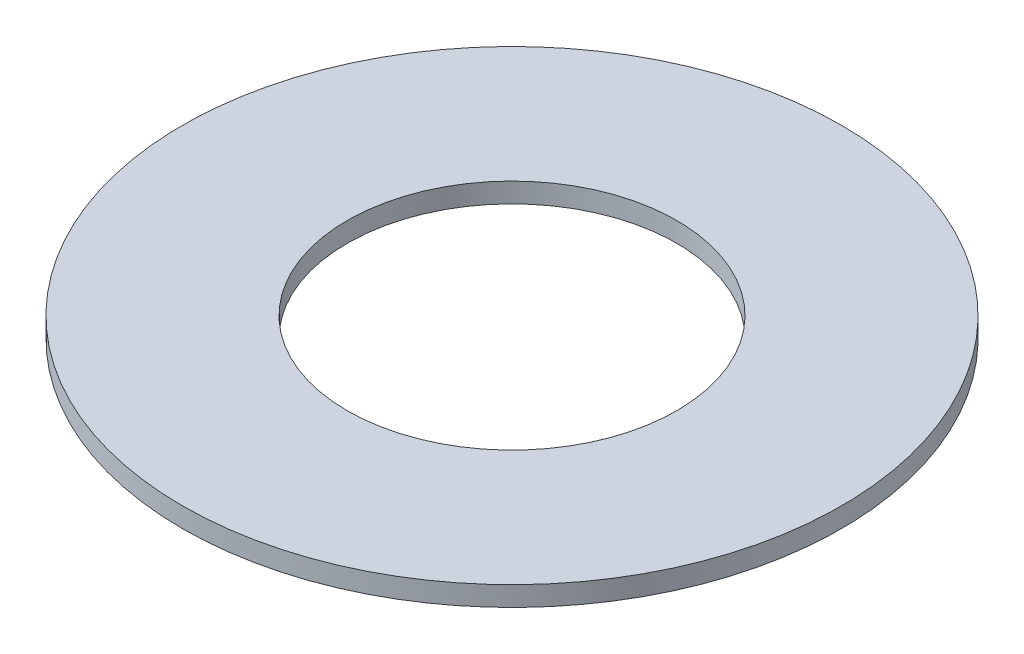
ISO-10303-21;
HEADER;
FILE_DESCRIPTION(('STEP AP214'),'2;1');
FILE_NAME('part.step','',(''),(''),'','','');
FILE_SCHEMA(('AUTOMOTIVE_DESIGN { 1 0 10303 214 1 1 1 1 }'));
ENDSEC;
DATA;
#1=APPLICATION_CONTEXT('core data for automotive mechanical design processes');
#2=APPLICATION_PROTOCOL_DEFINITION('international standard','automotive_design',2000,#1);
#3=PRODUCT_CONTEXT('',#1,'mechanical');
#4=PRODUCT('Part','Part','',(#3));
#5=PRODUCT_RELATED_PRODUCT_CATEGORY('part','',(#4));
#6=PRODUCT_DEFINITION_FORMATION('','',#4);
#7=PRODUCT_DEFINITION_CONTEXT('part definition',#1,'design');
#8=PRODUCT_DEFINITION('design','',#6,#7);
#9=PRODUCT_DEFINITION_SHAPE('','',#8);
#10=(LENGTH_UNIT() NAMED_UNIT(*) SI_UNIT(.MILLI.,.METRE.));
#11=(NAMED_UNIT(*) PLANE_ANGLE_UNIT() SI_UNIT($,.RADIAN.));
#12=(NAMED_UNIT(*) SI_UNIT($,.STERADIAN.) SOLID_ANGLE_UNIT());
#13=UNCERTAINTY_MEASURE_WITH_UNIT(LENGTH_MEASURE(1.E-05),#10,'distance_accuracy_value','');
#14=(GEOMETRIC_REPRESENTATION_CONTEXT(3) GLOBAL_UNCERTAINTY_ASSIGNED_CONTEXT((#13)) GLOBAL_UNIT_ASSIGNED_CONTEXT((#10,
#11,#12)) REPRESENTATION_CONTEXT('',''));
#15=CARTESIAN_POINT('',(0.,0.,0.));
#16=DIRECTION('',(0.,0.,1.));
#17=DIRECTION('',(1.,0.,0.));
#18=AXIS2_PLACEMENT_3D('',#15,#16,#17);
#19=CARTESIAN_POINT('',(0.,14.2862136821391,0.));
#20=DIRECTION('',(0.,1.,0.));
#21=DIRECTION('',(0.,0.,1.));
#22=AXIS2_PLACEMENT_3D('',#19,#20,#21);
#23=CYLINDRICAL_SURFACE('',#22,3.175);
#24=CARTESIAN_POINT('',(0.,-0.190500000000001,0.));
#25=DIRECTION('',(0.,1.,0.));
#26=DIRECTION('',(0.,0.,1.));
#27=AXIS2_PLACEMENT_3D('',#24,#25,#26);
#28=CIRCLE('',#27,3.175);
#29=CARTESIAN_POINT('',(0.,-0.190500000000001,3.175));
#30=VERTEX_POINT('',#29);
#31=EDGE_CURVE('E10',#30,#30,#28,.T.);
#32=ORIENTED_EDGE('',*,*,#31,.F.);
#33=EDGE_LOOP('',(#32));
#34=FACE_BOUND('',#33,.T.);
#35=CARTESIAN_POINT('',(0.,0.190499999999998,0.));
#36=DIRECTION('',(0.,1.,0.));
#37=DIRECTION('',(0.,0.,1.));
#38=AXIS2_PLACEMENT_3D('',#35,#36,#37);
#39=CIRCLE('',#38,3.175);
#40=CARTESIAN_POINT('',(0.,0.190499999999998,3.175));
#41=VERTEX_POINT('',#40);
#42=EDGE_CURVE('E55',#41,#41,#39,.T.);
#43=ORIENTED_EDGE('',*,*,#42,.T.);
#44=EDGE_LOOP('',(#43));
#45=FACE_BOUND('',#44,.T.);
#46=ADVANCED_FACE('F32',(#34,#45),#23,.F.);
#47=CARTESIAN_POINT('',(0.,-0.190500000000001,-3.175));
#48=DIRECTION('',(0.,1.,0.));
#49=DIRECTION('',(0.,0.,1.));
#50=AXIS2_PLACEMENT_3D('',#47,#48,#49);
#51=PLANE('',#50);
#52=CARTESIAN_POINT('',(0.,-0.190500000000001,0.));
#53=DIRECTION('',(0.,1.,0.));
#54=DIRECTION('',(0.,0.,1.));
#55=AXIS2_PLACEMENT_3D('',#52,#53,#54);
#56=CIRCLE('',#55,6.35);
#57=CARTESIAN_POINT('',(0.,-0.190500000000001,6.35));
#58=VERTEX_POINT('',#57);
#59=EDGE_CURVE('E39',#58,#58,#56,.T.);
#60=ORIENTED_EDGE('',*,*,#59,.F.);
#61=EDGE_LOOP('',(#60));
#62=FACE_BOUND('',#61,.T.);
#63=ORIENTED_EDGE('',*,*,#31,.T.);
#64=EDGE_LOOP('',(#63));
#65=FACE_BOUND('',#64,.T.);
#66=ADVANCED_FACE('F72',(#62,#65),#51,.F.);
#67=CARTESIAN_POINT('',(0.,14.2862136821391,0.));
#68=DIRECTION('',(0.,1.,0.));
#69=DIRECTION('',(0.,0.,1.));
#70=AXIS2_PLACEMENT_3D('',#67,#68,#69);
#71=CYLINDRICAL_SURFACE('',#70,6.35);
#72=CARTESIAN_POINT('',(0.,0.1905,0.));
#73=DIRECTION('',(0.,1.,0.));
#74=DIRECTION('',(0.,0.,1.));
#75=AXIS2_PLACEMENT_3D('',#72,#73,#74);
#76=CIRCLE('',#75,6.35);
#77=CARTESIAN_POINT('',(0.,0.1905,6.35));
#78=VERTEX_POINT('',#77);
#79=EDGE_CURVE('E47',#78,#78,#76,.T.);
#80=ORIENTED_EDGE('',*,*,#79,.F.);
#81=EDGE_LOOP('',(#80));
#82=FACE_BOUND('',#81,.T.);
#83=ORIENTED_EDGE('',*,*,#59,.T.);
#84=EDGE_LOOP('',(#83));
#85=FACE_BOUND('',#84,.T.);
#86=ADVANCED_FACE('F67',(#82,#85),#71,.T.);
#87=CARTESIAN_POINT('',(0.,0.190499999999999,-3.175));
#88=DIRECTION('',(0.,-1.,0.));
#89=DIRECTION('',(0.,0.,-1.));
#90=AXIS2_PLACEMENT_3D('',#87,#88,#89);
#91=PLANE('',#90);
#92=ORIENTED_EDGE('',*,*,#42,.F.);
#93=EDGE_LOOP('',(#92));
#94=FACE_BOUND('',#93,.T.);
#95=ORIENTED_EDGE('',*,*,#79,.T.);
#96=EDGE_LOOP('',(#95));
#97=FACE_BOUND('',#96,.T.);
#98=ADVANCED_FACE('F64',(#94,#97),#91,.F.);
#99=CLOSED_SHELL('',(#46,#66,#86,#98));
#100=MANIFOLD_SOLID_BREP('B2',#99);
#101=ADVANCED_BREP_SHAPE_REPRESENTATION('',(#18,#100),#14);
#102=SHAPE_DEFINITION_REPRESENTATION(#9,#101);
ENDSEC;
END-ISO-10303-21;
